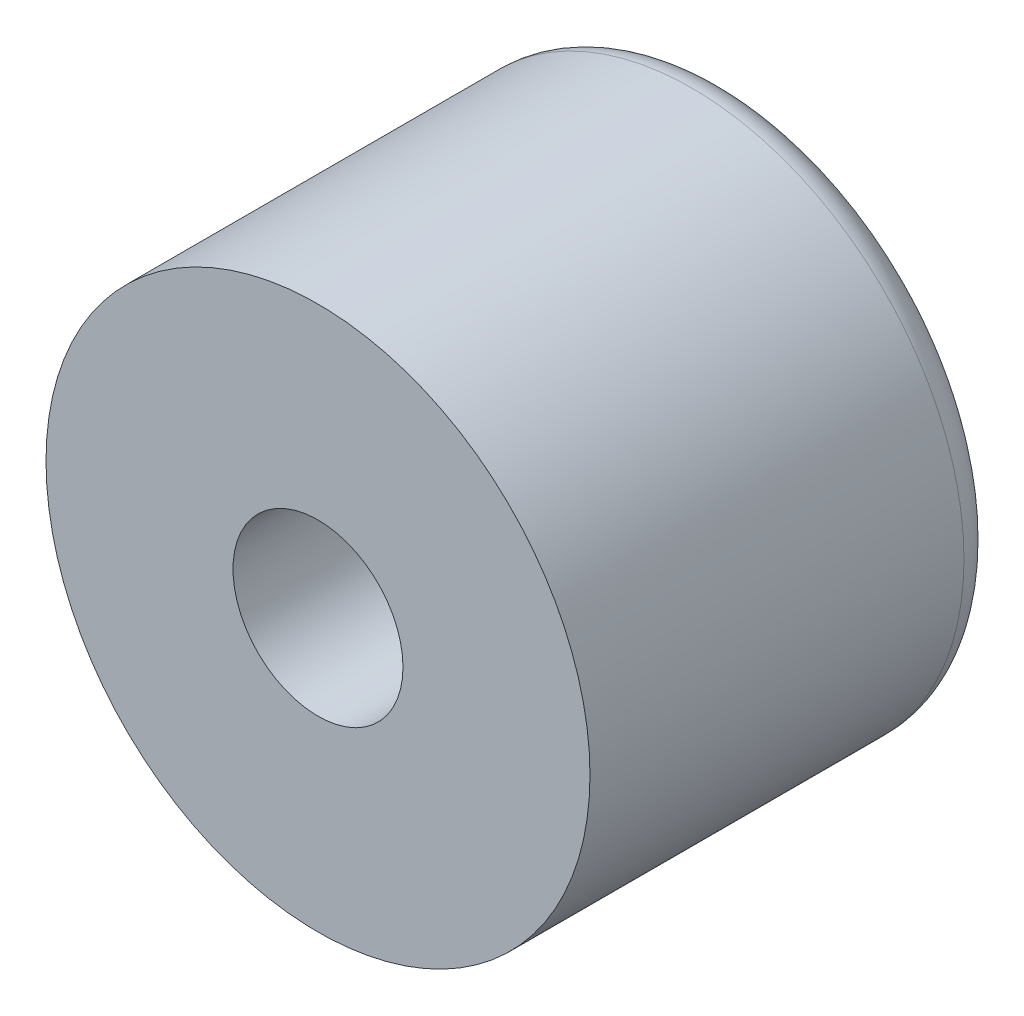
ISO-10303-21;
HEADER;
FILE_DESCRIPTION(('STEP AP214'),'2;1');
FILE_NAME('part.step','',(''),(''),'','','');
FILE_SCHEMA(('AUTOMOTIVE_DESIGN { 1 0 10303 214 1 1 1 1 }'));
ENDSEC;
DATA;
#1=APPLICATION_CONTEXT('core data for automotive mechanical design processes');
#2=APPLICATION_PROTOCOL_DEFINITION('international standard','automotive_design',2000,#1);
#3=PRODUCT_CONTEXT('',#1,'mechanical');
#4=PRODUCT('Part','Part','',(#3));
#5=PRODUCT_RELATED_PRODUCT_CATEGORY('part','',(#4));
#6=PRODUCT_DEFINITION_FORMATION('','',#4);
#7=PRODUCT_DEFINITION_CONTEXT('part definition',#1,'design');
#8=PRODUCT_DEFINITION('design','',#6,#7);
#9=PRODUCT_DEFINITION_SHAPE('','',#8);
#10=(LENGTH_UNIT() NAMED_UNIT(*) SI_UNIT(.MILLI.,.METRE.));
#11=(NAMED_UNIT(*) PLANE_ANGLE_UNIT() SI_UNIT($,.RADIAN.));
#12=(NAMED_UNIT(*) SI_UNIT($,.STERADIAN.) SOLID_ANGLE_UNIT());
#13=UNCERTAINTY_MEASURE_WITH_UNIT(LENGTH_MEASURE(1.E-05),#10,'distance_accuracy_value','');
#14=(GEOMETRIC_REPRESENTATION_CONTEXT(3) GLOBAL_UNCERTAINTY_ASSIGNED_CONTEXT((#13)) GLOBAL_UNIT_ASSIGNED_CONTEXT((#10,
#11,#12)) REPRESENTATION_CONTEXT('',''));
#15=CARTESIAN_POINT('',(0.,0.,0.));
#16=DIRECTION('',(0.,0.,1.));
#17=DIRECTION('',(1.,0.,0.));
#18=AXIS2_PLACEMENT_3D('',#15,#16,#17);
#19=CARTESIAN_POINT('',(0.,0.,12.));
#20=DIRECTION('',(0.,0.,-1.));
#21=DIRECTION('',(-1.,0.,0.));
#22=AXIS2_PLACEMENT_3D('',#19,#20,#21);
#23=CYLINDRICAL_SURFACE('',#22,8.);
#24=CARTESIAN_POINT('',(0.,0.,1.));
#25=DIRECTION('',(0.,0.,1.));
#26=DIRECTION('',(1.,0.,0.));
#27=AXIS2_PLACEMENT_3D('',#24,#25,#26);
#28=CIRCLE('',#27,8.);
#29=CARTESIAN_POINT('',(8.,0.,1.));
#30=VERTEX_POINT('',#29);
#31=EDGE_CURVE('E40',#30,#30,#28,.T.);
#32=ORIENTED_EDGE('',*,*,#31,.T.);
#33=EDGE_LOOP('',(#32));
#34=FACE_BOUND('',#33,.T.);
#35=CARTESIAN_POINT('',(0.,0.,12.));
#36=DIRECTION('',(0.,0.,1.));
#37=DIRECTION('',(1.,0.,0.));
#38=AXIS2_PLACEMENT_3D('',#35,#36,#37);
#39=CIRCLE('',#38,8.);
#40=CARTESIAN_POINT('',(8.,0.,12.));
#41=VERTEX_POINT('',#40);
#42=EDGE_CURVE('E44',#41,#41,#39,.T.);
#43=ORIENTED_EDGE('',*,*,#42,.F.);
#44=EDGE_LOOP('',(#43));
#45=FACE_BOUND('',#44,.T.);
#46=ADVANCED_FACE('F33',(#34,#45),#23,.T.);
#47=CARTESIAN_POINT('',(0.,0.,12.));
#48=DIRECTION('',(0.,0.,1.));
#49=DIRECTION('',(1.,0.,0.));
#50=AXIS2_PLACEMENT_3D('',#47,#48,#49);
#51=PLANE('',#50);
#52=CARTESIAN_POINT('',(0.,0.,12.));
#53=DIRECTION('',(0.,0.,1.));
#54=DIRECTION('',(1.,0.,0.));
#55=AXIS2_PLACEMENT_3D('',#52,#53,#54);
#56=CIRCLE('',#55,2.5);
#57=CARTESIAN_POINT('',(2.5,0.,12.));
#58=VERTEX_POINT('',#57);
#59=EDGE_CURVE('E51',#58,#58,#56,.T.);
#60=ORIENTED_EDGE('',*,*,#59,.F.);
#61=EDGE_LOOP('',(#60));
#62=FACE_BOUND('',#61,.T.);
#63=ORIENTED_EDGE('',*,*,#42,.T.);
#64=EDGE_LOOP('',(#63));
#65=FACE_BOUND('',#64,.T.);
#66=ADVANCED_FACE('F66',(#62,#65),#51,.T.);
#67=CARTESIAN_POINT('',(0.,0.,0.));
#68=DIRECTION('',(0.,0.,1.));
#69=DIRECTION('',(1.,0.,0.));
#70=AXIS2_PLACEMENT_3D('',#67,#68,#69);
#71=PLANE('',#70);
#72=CARTESIAN_POINT('',(0.,0.,0.));
#73=DIRECTION('',(0.,0.,1.));
#74=DIRECTION('',(1.,0.,0.));
#75=AXIS2_PLACEMENT_3D('',#72,#73,#74);
#76=CIRCLE('',#75,7.);
#77=CARTESIAN_POINT('',(7.,0.,0.));
#78=VERTEX_POINT('',#77);
#79=EDGE_CURVE('E10',#78,#78,#76,.F.);
#80=ORIENTED_EDGE('',*,*,#79,.T.);
#81=EDGE_LOOP('',(#80));
#82=FACE_BOUND('',#81,.T.);
#83=ADVANCED_FACE('F62',(#82),#71,.F.);
#84=CARTESIAN_POINT('',(0.,0.,7.));
#85=DIRECTION('',(0.,0.,1.));
#86=DIRECTION('',(1.,0.,0.));
#87=AXIS2_PLACEMENT_3D('',#84,#85,#86);
#88=CYLINDRICAL_SURFACE('',#87,2.5);
#89=CARTESIAN_POINT('',(0.,0.,7.));
#90=DIRECTION('',(0.,0.,1.));
#91=DIRECTION('',(1.,0.,0.));
#92=AXIS2_PLACEMENT_3D('',#89,#90,#91);
#93=CIRCLE('',#92,2.5);
#94=CARTESIAN_POINT('',(2.5,0.,7.));
#95=VERTEX_POINT('',#94);
#96=EDGE_CURVE('E48',#95,#95,#93,.T.);
#97=ORIENTED_EDGE('',*,*,#96,.F.);
#98=EDGE_LOOP('',(#97));
#99=FACE_BOUND('',#98,.T.);
#100=ORIENTED_EDGE('',*,*,#59,.T.);
#101=EDGE_LOOP('',(#100));
#102=FACE_BOUND('',#101,.T.);
#103=ADVANCED_FACE('F59',(#99,#102),#88,.F.);
#104=CARTESIAN_POINT('',(0.,0.,7.));
#105=DIRECTION('',(0.,0.,1.));
#106=DIRECTION('',(1.,0.,0.));
#107=AXIS2_PLACEMENT_3D('',#104,#105,#106);
#108=PLANE('',#107);
#109=ORIENTED_EDGE('',*,*,#96,.T.);
#110=EDGE_LOOP('',(#109));
#111=FACE_BOUND('',#110,.T.);
#112=ADVANCED_FACE('F57',(#111),#108,.T.);
#113=CARTESIAN_POINT('',(0.,0.,1.));
#114=DIRECTION('',(0.,0.,1.));
#115=DIRECTION('',(1.,0.,0.));
#116=AXIS2_PLACEMENT_3D('',#113,#114,#115);
#117=TOROIDAL_SURFACE('',#116,7.,1.);
#118=ORIENTED_EDGE('',*,*,#79,.F.);
#119=EDGE_LOOP('',(#118));
#120=FACE_BOUND('',#119,.T.);
#121=ORIENTED_EDGE('',*,*,#31,.F.);
#122=EDGE_LOOP('',(#121));
#123=FACE_BOUND('',#122,.T.);
#124=ADVANCED_FACE('F35',(#120,#123),#117,.T.);
#125=CLOSED_SHELL('',(#46,#66,#83,#103,#112,#124));
#126=MANIFOLD_SOLID_BREP('B2',#125);
#127=ADVANCED_BREP_SHAPE_REPRESENTATION('',(#18,#126),#14);
#128=SHAPE_DEFINITION_REPRESENTATION(#9,#127);
ENDSEC;
END-ISO-10303-21;
